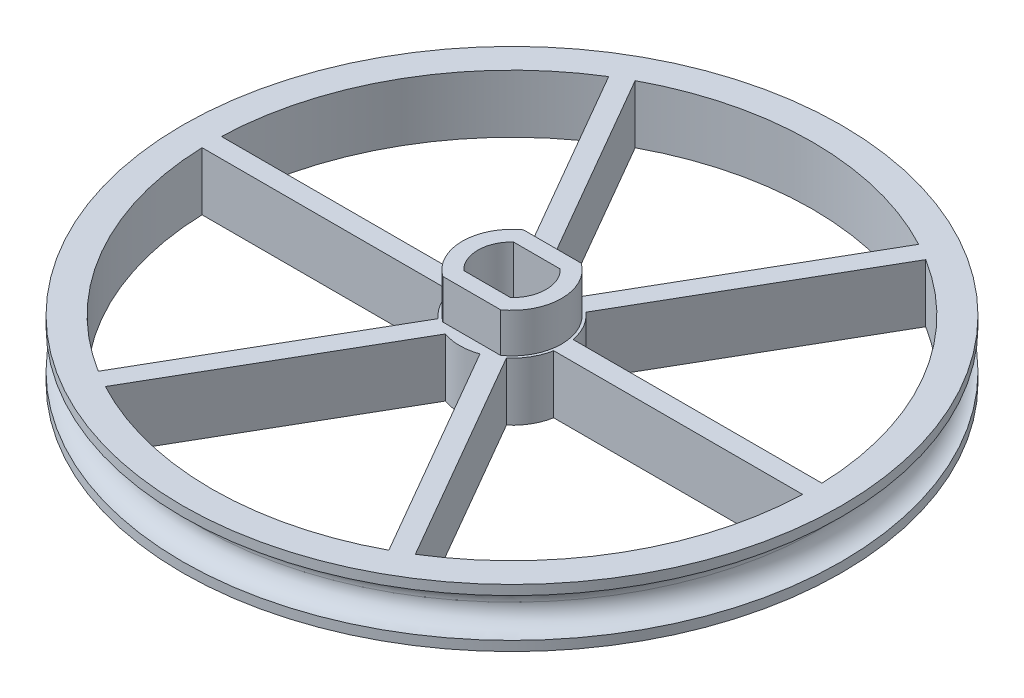
ISO-10303-21;
HEADER;
FILE_DESCRIPTION(('STEP AP214'),'2;1');
FILE_NAME('part.step','',(''),(''),'','','');
FILE_SCHEMA(('AUTOMOTIVE_DESIGN { 1 0 10303 214 1 1 1 1 }'));
ENDSEC;
DATA;
#1=APPLICATION_CONTEXT('core data for automotive mechanical design processes');
#2=APPLICATION_PROTOCOL_DEFINITION('international standard','automotive_design',2000,#1);
#3=PRODUCT_CONTEXT('',#1,'mechanical');
#4=PRODUCT('Part','Part','',(#3));
#5=PRODUCT_RELATED_PRODUCT_CATEGORY('part','',(#4));
#6=PRODUCT_DEFINITION_FORMATION('','',#4);
#7=PRODUCT_DEFINITION_CONTEXT('part definition',#1,'design');
#8=PRODUCT_DEFINITION('design','',#6,#7);
#9=PRODUCT_DEFINITION_SHAPE('','',#8);
#10=(LENGTH_UNIT() NAMED_UNIT(*) SI_UNIT(.MILLI.,.METRE.));
#11=(NAMED_UNIT(*) PLANE_ANGLE_UNIT() SI_UNIT($,.RADIAN.));
#12=(NAMED_UNIT(*) SI_UNIT($,.STERADIAN.) SOLID_ANGLE_UNIT());
#13=UNCERTAINTY_MEASURE_WITH_UNIT(LENGTH_MEASURE(1.E-05),#10,'distance_accuracy_value','');
#14=(GEOMETRIC_REPRESENTATION_CONTEXT(3) GLOBAL_UNCERTAINTY_ASSIGNED_CONTEXT((#13)) GLOBAL_UNIT_ASSIGNED_CONTEXT((#10,
#11,#12)) REPRESENTATION_CONTEXT('',''));
#15=CARTESIAN_POINT('',(0.,0.,0.));
#16=DIRECTION('',(0.,0.,1.));
#17=DIRECTION('',(1.,0.,0.));
#18=AXIS2_PLACEMENT_3D('',#15,#16,#17);
#19=CARTESIAN_POINT('',(0.,-1.96265906091624,0.));
#20=DIRECTION('',(0.,-1.,0.));
#21=DIRECTION('',(0.,0.,-1.));
#22=AXIS2_PLACEMENT_3D('',#19,#20,#21);
#23=CYLINDRICAL_SURFACE('',#22,24.60625);
#24=CARTESIAN_POINT('',(0.,-0.79375,0.));
#25=DIRECTION('',(0.,-1.,0.));
#26=DIRECTION('',(0.,0.,-1.));
#27=AXIS2_PLACEMENT_3D('',#24,#25,#26);
#28=CIRCLE('',#27,24.60625);
#29=CARTESIAN_POINT('',(24.5934442484171,-0.79375,0.793750000000001));
#30=VERTEX_POINT('',#29);
#31=CARTESIAN_POINT('',(12.9841297884627,-0.79375,20.9016724856853));
#32=VERTEX_POINT('',#31);
#33=EDGE_CURVE('E529',#30,#32,#28,.T.);
#34=ORIENTED_EDGE('',*,*,#33,.T.);
#35=DIRECTION('',(0.,-1.,0.));
#36=VECTOR('',#35,1.);
#37=CARTESIAN_POINT('',(12.9841297884627,-1.96265906091624,20.9016724856853));
#38=LINE('',#37,#36);
#39=CARTESIAN_POINT('',(12.9841297884627,3.96875,20.9016724856853));
#40=VERTEX_POINT('',#39);
#41=EDGE_CURVE('E322',#32,#40,#38,.F.);
#42=ORIENTED_EDGE('',*,*,#41,.T.);
#43=CARTESIAN_POINT('',(0.,3.96875,0.));
#44=DIRECTION('',(0.,-1.,0.));
#45=DIRECTION('',(0.,0.,-1.));
#46=AXIS2_PLACEMENT_3D('',#43,#44,#45);
#47=CIRCLE('',#46,24.60625);
#48=CARTESIAN_POINT('',(24.5934442484171,3.96875,0.793750000000001));
#49=VERTEX_POINT('',#48);
#50=EDGE_CURVE('E523',#49,#40,#47,.T.);
#51=ORIENTED_EDGE('',*,*,#50,.F.);
#52=DIRECTION('',(0.,-1.,0.));
#53=VECTOR('',#52,1.);
#54=CARTESIAN_POINT('',(24.5934442484171,-1.96265906091624,0.793750000000001));
#55=LINE('',#54,#53);
#56=EDGE_CURVE('E496',#49,#30,#55,.T.);
#57=ORIENTED_EDGE('',*,*,#56,.T.);
#58=EDGE_LOOP('',(#34,#42,#51,#57));
#59=FACE_BOUND('',#58,.T.);
#60=ADVANCED_FACE('F51',(#59),#23,.F.);
#61=CARTESIAN_POINT('',(0.,-1.96265906091624,0.));
#62=DIRECTION('',(0.,-1.,0.));
#63=DIRECTION('',(0.,0.,-1.));
#64=AXIS2_PLACEMENT_3D('',#61,#62,#63);
#65=CYLINDRICAL_SURFACE('',#64,4.28624999999999);
#66=DIRECTION('',(0.,-1.,0.));
#67=VECTOR('',#66,1.);
#68=CARTESIAN_POINT('',(2.79346440612961,-1.96265906091624,3.25092228055161));
#69=LINE('',#68,#67);
#70=CARTESIAN_POINT('',(2.79346440612961,-0.79375,3.25092228055161));
#71=VERTEX_POINT('',#70);
#72=CARTESIAN_POINT('',(2.79346440612961,3.96875,3.25092228055161));
#73=VERTEX_POINT('',#72);
#74=EDGE_CURVE('E357',#71,#73,#69,.F.);
#75=ORIENTED_EDGE('',*,*,#74,.F.);
#76=CARTESIAN_POINT('',(0.,-0.79375,0.));
#77=DIRECTION('',(0.,-1.,0.));
#78=DIRECTION('',(0.,0.,-1.));
#79=AXIS2_PLACEMENT_3D('',#76,#77,#78);
#80=CIRCLE('',#79,4.28624999999999);
#81=CARTESIAN_POINT('',(4.21211348375135,-0.79375,0.793750000000001));
#82=VERTEX_POINT('',#81);
#83=EDGE_CURVE('E483',#82,#71,#80,.T.);
#84=ORIENTED_EDGE('',*,*,#83,.F.);
#85=DIRECTION('',(0.,-1.,0.));
#86=VECTOR('',#85,1.);
#87=CARTESIAN_POINT('',(4.21211348375135,-1.96265906091624,0.793750000000001));
#88=LINE('',#87,#86);
#89=CARTESIAN_POINT('',(4.21211348375135,3.96875,0.793750000000001));
#90=VERTEX_POINT('',#89);
#91=EDGE_CURVE('E542',#82,#90,#88,.F.);
#92=ORIENTED_EDGE('',*,*,#91,.T.);
#93=CARTESIAN_POINT('',(0.,3.96875,0.));
#94=DIRECTION('',(0.,-1.,0.));
#95=DIRECTION('',(0.,0.,-1.));
#96=AXIS2_PLACEMENT_3D('',#93,#94,#95);
#97=CIRCLE('',#96,4.28624999999999);
#98=EDGE_CURVE('E478',#90,#73,#97,.T.);
#99=ORIENTED_EDGE('',*,*,#98,.T.);
#100=EDGE_LOOP('',(#75,#84,#92,#99));
#101=FACE_BOUND('',#100,.T.);
#102=ADVANCED_FACE('F594',(#101),#65,.T.);
#103=CARTESIAN_POINT('',(11.6093144599549,3.96875,21.6954224856854));
#104=VERTEX_POINT('',#103);
#105=CARTESIAN_POINT('',(-11.6093144599544,3.96875,21.6954224856856));
#106=VERTEX_POINT('',#105);
#107=EDGE_CURVE('E528',#104,#106,#47,.T.);
#108=ORIENTED_EDGE('',*,*,#107,.F.);
#109=DIRECTION('',(0.,-1.,0.));
#110=VECTOR('',#109,1.);
#111=CARTESIAN_POINT('',(11.6093144599549,-1.96265906091624,21.6954224856854));
#112=LINE('',#111,#110);
#113=CARTESIAN_POINT('',(11.6093144599549,-0.79375,21.6954224856854));
#114=VERTEX_POINT('',#113);
#115=EDGE_CURVE('E336',#104,#114,#112,.T.);
#116=ORIENTED_EDGE('',*,*,#115,.T.);
#117=CARTESIAN_POINT('',(-11.6093144599544,-0.79375,21.6954224856856));
#118=VERTEX_POINT('',#117);
#119=EDGE_CURVE('E534',#114,#118,#28,.T.);
#120=ORIENTED_EDGE('',*,*,#119,.T.);
#121=DIRECTION('',(0.,-1.,0.));
#122=VECTOR('',#121,1.);
#123=CARTESIAN_POINT('',(-11.6093144599544,-1.96265906091624,21.6954224856856));
#124=LINE('',#123,#122);
#125=EDGE_CURVE('E361',#118,#106,#124,.F.);
#126=ORIENTED_EDGE('',*,*,#125,.T.);
#127=EDGE_LOOP('',(#108,#116,#120,#126));
#128=FACE_BOUND('',#127,.T.);
#129=ADVANCED_FACE('F597',(#128),#23,.F.);
#130=DIRECTION('',(0.,-1.,0.));
#131=VECTOR('',#130,1.);
#132=CARTESIAN_POINT('',(1.41864907762182,-1.96265906091624,4.04467228055163));
#133=LINE('',#132,#131);
#134=CARTESIAN_POINT('',(1.41864907762182,3.96875,4.04467228055163));
#135=VERTEX_POINT('',#134);
#136=CARTESIAN_POINT('',(1.41864907762182,-0.79375,4.04467228055163));
#137=VERTEX_POINT('',#136);
#138=EDGE_CURVE('E344',#135,#137,#133,.T.);
#139=ORIENTED_EDGE('',*,*,#138,.F.);
#140=CARTESIAN_POINT('',(-1.41864907762174,3.96875,4.04467228055166));
#141=VERTEX_POINT('',#140);
#142=EDGE_CURVE('E482',#135,#141,#97,.T.);
#143=ORIENTED_EDGE('',*,*,#142,.T.);
#144=DIRECTION('',(0.,-1.,0.));
#145=VECTOR('',#144,1.);
#146=CARTESIAN_POINT('',(-1.41864907762174,-1.96265906091624,4.04467228055166));
#147=LINE('',#146,#145);
#148=CARTESIAN_POINT('',(-1.41864907762174,-0.79375,4.04467228055166));
#149=VERTEX_POINT('',#148);
#150=EDGE_CURVE('E388',#149,#141,#147,.F.);
#151=ORIENTED_EDGE('',*,*,#150,.F.);
#152=EDGE_CURVE('E488',#137,#149,#80,.T.);
#153=ORIENTED_EDGE('',*,*,#152,.F.);
#154=EDGE_LOOP('',(#139,#143,#151,#153));
#155=FACE_BOUND('',#154,.T.);
#156=ADVANCED_FACE('F605',(#155),#65,.T.);
#157=CARTESIAN_POINT('',(-12.9841297884623,3.96875,20.9016724856856));
#158=VERTEX_POINT('',#157);
#159=CARTESIAN_POINT('',(-24.5934442484171,3.96875,0.793749999999999));
#160=VERTEX_POINT('',#159);
#161=EDGE_CURVE('E649',#158,#160,#47,.T.);
#162=ORIENTED_EDGE('',*,*,#161,.F.);
#163=DIRECTION('',(0.,-1.,0.));
#164=VECTOR('',#163,1.);
#165=CARTESIAN_POINT('',(-12.9841297884622,-1.96265906091624,20.9016724856856));
#166=LINE('',#165,#164);
#167=CARTESIAN_POINT('',(-12.9841297884622,-0.79375,20.9016724856856));
#168=VERTEX_POINT('',#167);
#169=EDGE_CURVE('E365',#158,#168,#166,.T.);
#170=ORIENTED_EDGE('',*,*,#169,.T.);
#171=CARTESIAN_POINT('',(-24.5934442484171,-0.79375,0.793749999999999));
#172=VERTEX_POINT('',#171);
#173=EDGE_CURVE('E715',#168,#172,#28,.T.);
#174=ORIENTED_EDGE('',*,*,#173,.T.);
#175=DIRECTION('',(0.,-1.,0.));
#176=VECTOR('',#175,1.);
#177=CARTESIAN_POINT('',(-24.5934442484171,-1.96265906091624,0.793749999999999));
#178=LINE('',#177,#176);
#179=EDGE_CURVE('E392',#172,#160,#178,.F.);
#180=ORIENTED_EDGE('',*,*,#179,.T.);
#181=EDGE_LOOP('',(#162,#170,#174,#180));
#182=FACE_BOUND('',#181,.T.);
#183=ADVANCED_FACE('F611',(#182),#23,.F.);
#184=DIRECTION('',(0.,-1.,0.));
#185=VECTOR('',#184,1.);
#186=CARTESIAN_POINT('',(-2.79346440612955,-1.96265906091624,3.25092228055167));
#187=LINE('',#186,#185);
#188=CARTESIAN_POINT('',(-2.79346440612954,3.96875,3.25092228055167));
#189=VERTEX_POINT('',#188);
#190=CARTESIAN_POINT('',(-2.79346440612955,-0.79375,3.25092228055167));
#191=VERTEX_POINT('',#190);
#192=EDGE_CURVE('E374',#189,#191,#187,.T.);
#193=ORIENTED_EDGE('',*,*,#192,.F.);
#194=CARTESIAN_POINT('',(-4.21211348375135,3.96875,0.793749999999999));
#195=VERTEX_POINT('',#194);
#196=EDGE_CURVE('E692',#189,#195,#97,.T.);
#197=ORIENTED_EDGE('',*,*,#196,.T.);
#198=DIRECTION('',(0.,-1.,0.));
#199=VECTOR('',#198,1.);
#200=CARTESIAN_POINT('',(-4.21211348375135,-1.96265906091624,0.793749999999999));
#201=LINE('',#200,#199);
#202=CARTESIAN_POINT('',(-4.21211348375135,-0.79375,0.793749999999999));
#203=VERTEX_POINT('',#202);
#204=EDGE_CURVE('E419',#203,#195,#201,.F.);
#205=ORIENTED_EDGE('',*,*,#204,.F.);
#206=EDGE_CURVE('E718',#191,#203,#80,.T.);
#207=ORIENTED_EDGE('',*,*,#206,.F.);
#208=EDGE_LOOP('',(#193,#197,#205,#207));
#209=FACE_BOUND('',#208,.T.);
#210=ADVANCED_FACE('F633',(#209),#65,.T.);
#211=CARTESIAN_POINT('',(-24.5934442484171,3.96875,-0.793750000000001));
#212=VERTEX_POINT('',#211);
#213=CARTESIAN_POINT('',(-12.9841297884625,3.96875,-20.9016724856854));
#214=VERTEX_POINT('',#213);
#215=EDGE_CURVE('E655',#212,#214,#47,.T.);
#216=ORIENTED_EDGE('',*,*,#215,.F.);
#217=DIRECTION('',(0.,-1.,0.));
#218=VECTOR('',#217,1.);
#219=CARTESIAN_POINT('',(-24.5934442484171,-1.96265906091624,-0.793750000000001));
#220=LINE('',#219,#218);
#221=CARTESIAN_POINT('',(-24.5934442484171,-0.79375,-0.793750000000001));
#222=VERTEX_POINT('',#221);
#223=EDGE_CURVE('E396',#212,#222,#220,.T.);
#224=ORIENTED_EDGE('',*,*,#223,.T.);
#225=CARTESIAN_POINT('',(-12.9841297884625,-0.79375,-20.9016724856854));
#226=VERTEX_POINT('',#225);
#227=EDGE_CURVE('E739',#222,#226,#28,.T.);
#228=ORIENTED_EDGE('',*,*,#227,.T.);
#229=DIRECTION('',(0.,-1.,0.));
#230=VECTOR('',#229,1.);
#231=CARTESIAN_POINT('',(-12.9841297884625,-1.96265906091624,-20.9016724856854));
#232=LINE('',#231,#230);
#233=EDGE_CURVE('E423',#226,#214,#232,.F.);
#234=ORIENTED_EDGE('',*,*,#233,.T.);
#235=EDGE_LOOP('',(#216,#224,#228,#234));
#236=FACE_BOUND('',#235,.T.);
#237=ADVANCED_FACE('F627',(#236),#23,.F.);
#238=DIRECTION('',(0.,-1.,0.));
#239=VECTOR('',#238,1.);
#240=CARTESIAN_POINT('',(-4.21211348375135,-1.96265906091624,-0.793750000000001));
#241=LINE('',#240,#239);
#242=CARTESIAN_POINT('',(-4.21211348375135,3.96875,-0.793750000000001));
#243=VERTEX_POINT('',#242);
#244=CARTESIAN_POINT('',(-4.21211348375135,-0.79375,-0.793750000000001));
#245=VERTEX_POINT('',#244);
#246=EDGE_CURVE('E405',#243,#245,#241,.T.);
#247=ORIENTED_EDGE('',*,*,#246,.F.);
#248=CARTESIAN_POINT('',(-2.79346440612959,3.96875,-3.25092228055163));
#249=VERTEX_POINT('',#248);
#250=EDGE_CURVE('E687',#243,#249,#97,.T.);
#251=ORIENTED_EDGE('',*,*,#250,.T.);
#252=DIRECTION('',(0.,-1.,0.));
#253=VECTOR('',#252,1.);
#254=CARTESIAN_POINT('',(-2.79346440612959,-1.96265906091624,-3.25092228055163));
#255=LINE('',#254,#253);
#256=CARTESIAN_POINT('',(-2.79346440612959,-0.79375,-3.25092228055163));
#257=VERTEX_POINT('',#256);
#258=EDGE_CURVE('E450',#257,#249,#255,.F.);
#259=ORIENTED_EDGE('',*,*,#258,.F.);
#260=EDGE_CURVE('E721',#245,#257,#80,.T.);
#261=ORIENTED_EDGE('',*,*,#260,.F.);
#262=EDGE_LOOP('',(#247,#251,#259,#261));
#263=FACE_BOUND('',#262,.T.);
#264=ADVANCED_FACE('F625',(#263),#65,.T.);
#265=CARTESIAN_POINT('',(-11.6093144599547,3.96875,-21.6954224856854));
#266=VERTEX_POINT('',#265);
#267=CARTESIAN_POINT('',(11.6093144599546,3.96875,-21.6954224856855));
#268=VERTEX_POINT('',#267);
#269=EDGE_CURVE('E658',#266,#268,#47,.T.);
#270=ORIENTED_EDGE('',*,*,#269,.F.);
#271=DIRECTION('',(0.,-1.,0.));
#272=VECTOR('',#271,1.);
#273=CARTESIAN_POINT('',(-11.6093144599548,-1.96265906091624,-21.6954224856854));
#274=LINE('',#273,#272);
#275=CARTESIAN_POINT('',(-11.6093144599548,-0.79375,-21.6954224856854));
#276=VERTEX_POINT('',#275);
#277=EDGE_CURVE('E427',#266,#276,#274,.T.);
#278=ORIENTED_EDGE('',*,*,#277,.T.);
#279=CARTESIAN_POINT('',(11.6093144599546,-0.79375,-21.6954224856855));
#280=VERTEX_POINT('',#279);
#281=EDGE_CURVE('E677',#276,#280,#28,.T.);
#282=ORIENTED_EDGE('',*,*,#281,.T.);
#283=DIRECTION('',(0.,-1.,0.));
#284=VECTOR('',#283,1.);
#285=CARTESIAN_POINT('',(11.6093144599546,-1.96265906091624,-21.6954224856855));
#286=LINE('',#285,#284);
#287=EDGE_CURVE('E454',#280,#268,#286,.F.);
#288=ORIENTED_EDGE('',*,*,#287,.T.);
#289=EDGE_LOOP('',(#270,#278,#282,#288));
#290=FACE_BOUND('',#289,.T.);
#291=ADVANCED_FACE('F614',(#290),#23,.F.);
#292=DIRECTION('',(0.,-1.,0.));
#293=VECTOR('',#292,1.);
#294=CARTESIAN_POINT('',(-1.4186490776218,-1.96265906091624,-4.04467228055164));
#295=LINE('',#294,#293);
#296=CARTESIAN_POINT('',(-1.4186490776218,3.96875,-4.04467228055164));
#297=VERTEX_POINT('',#296);
#298=CARTESIAN_POINT('',(-1.4186490776218,-0.79375,-4.04467228055164));
#299=VERTEX_POINT('',#298);
#300=EDGE_CURVE('E436',#297,#299,#295,.T.);
#301=ORIENTED_EDGE('',*,*,#300,.F.);
#302=CARTESIAN_POINT('',(1.41864907762177,3.96875,-4.04467228055165));
#303=VERTEX_POINT('',#302);
#304=EDGE_CURVE('E684',#297,#303,#97,.T.);
#305=ORIENTED_EDGE('',*,*,#304,.T.);
#306=DIRECTION('',(0.,-1.,0.));
#307=VECTOR('',#306,1.);
#308=CARTESIAN_POINT('',(1.41864907762177,-1.96265906091624,-4.04467228055165));
#309=LINE('',#308,#307);
#310=CARTESIAN_POINT('',(1.41864907762177,-0.79375,-4.04467228055165));
#311=VERTEX_POINT('',#310);
#312=EDGE_CURVE('E549',#311,#303,#309,.F.);
#313=ORIENTED_EDGE('',*,*,#312,.F.);
#314=EDGE_CURVE('E682',#299,#311,#80,.T.);
#315=ORIENTED_EDGE('',*,*,#314,.F.);
#316=EDGE_LOOP('',(#301,#305,#313,#315));
#317=FACE_BOUND('',#316,.T.);
#318=ADVANCED_FACE('F624',(#317),#65,.T.);
#319=CARTESIAN_POINT('',(0.,-1.96265906091624,0.));
#320=DIRECTION('',(0.,-1.,0.));
#321=DIRECTION('',(0.,0.,-1.));
#322=AXIS2_PLACEMENT_3D('',#319,#320,#321);
#323=CYLINDRICAL_SURFACE('',#322,26.9875);
#324=CARTESIAN_POINT('',(0.,-0.79375,0.));
#325=DIRECTION('',(0.,-1.,0.));
#326=DIRECTION('',(0.,0.,-1.));
#327=AXIS2_PLACEMENT_3D('',#324,#325,#326);
#328=CIRCLE('',#327,26.9875);
#329=CARTESIAN_POINT('',(0.,-0.79375,-26.9875));
#330=VERTEX_POINT('',#329);
#331=EDGE_CURVE('E533',#330,#330,#328,.T.);
#332=ORIENTED_EDGE('',*,*,#331,.F.);
#333=EDGE_LOOP('',(#332));
#334=FACE_BOUND('',#333,.T.);
#335=CARTESIAN_POINT('',(0.,0.,0.));
#336=DIRECTION('',(0.,-1.,0.));
#337=DIRECTION('',(0.,0.,-1.));
#338=AXIS2_PLACEMENT_3D('',#335,#336,#337);
#339=CIRCLE('',#338,26.9875);
#340=CARTESIAN_POINT('',(0.,0.,-26.9875));
#341=VERTEX_POINT('',#340);
#342=EDGE_CURVE('E538',#341,#341,#339,.T.);
#343=ORIENTED_EDGE('',*,*,#342,.T.);
#344=EDGE_LOOP('',(#343));
#345=FACE_BOUND('',#344,.T.);
#346=ADVANCED_FACE('F621',(#334,#345),#323,.T.);
#347=CARTESIAN_POINT('',(-26.9875,-0.79375,0.));
#348=DIRECTION('',(0.,1.,0.));
#349=DIRECTION('',(0.,0.,1.));
#350=AXIS2_PLACEMENT_3D('',#347,#348,#349);
#351=PLANE('',#350);
#352=DIRECTION('',(1.,0.,0.));
#353=VECTOR('',#352,1.);
#354=CARTESIAN_POINT('',(1.91765794655877,-0.79375,-2.032));
#355=LINE('',#354,#353);
#356=CARTESIAN_POINT('',(-1.91765794655877,-0.79375,-2.032));
#357=VERTEX_POINT('',#356);
#358=CARTESIAN_POINT('',(1.91765794655877,-0.79375,-2.032));
#359=VERTEX_POINT('',#358);
#360=EDGE_CURVE('E275',#357,#359,#355,.T.);
#361=ORIENTED_EDGE('',*,*,#360,.F.);
#362=CARTESIAN_POINT('',(0.,-0.79375,0.));
#363=DIRECTION('',(0.,-1.,0.));
#364=DIRECTION('',(0.,0.,-1.));
#365=AXIS2_PLACEMENT_3D('',#362,#363,#364);
#366=CIRCLE('',#365,2.794);
#367=CARTESIAN_POINT('',(-1.91765794655877,-0.79375,2.032));
#368=VERTEX_POINT('',#367);
#369=EDGE_CURVE('E68',#368,#357,#366,.T.);
#370=ORIENTED_EDGE('',*,*,#369,.F.);
#371=DIRECTION('',(-1.,0.,0.));
#372=VECTOR('',#371,1.);
#373=CARTESIAN_POINT('',(1.91765794655877,-0.79375,2.032));
#374=LINE('',#373,#372);
#375=CARTESIAN_POINT('',(1.91765794655877,-0.79375,2.032));
#376=VERTEX_POINT('',#375);
#377=EDGE_CURVE('E283',#376,#368,#374,.T.);
#378=ORIENTED_EDGE('',*,*,#377,.F.);
#379=CARTESIAN_POINT('',(0.,-0.79375,0.));
#380=DIRECTION('',(0.,-1.,0.));
#381=DIRECTION('',(0.,0.,-1.));
#382=AXIS2_PLACEMENT_3D('',#379,#380,#381);
#383=CIRCLE('',#382,2.794);
#384=EDGE_CURVE('E265',#359,#376,#383,.T.);
#385=ORIENTED_EDGE('',*,*,#384,.F.);
#386=EDGE_LOOP('',(#361,#370,#378,#385));
#387=FACE_BOUND('',#386,.T.);
#388=DIRECTION('',(0.50000000000001,0.,0.866025403784433));
#389=VECTOR('',#388,1.);
#390=CARTESIAN_POINT('',(1.32871733574614,-0.79375,3.88890593440978));
#391=LINE('',#390,#389);
#392=EDGE_CURVE('E345',#137,#114,#391,.T.);
#393=ORIENTED_EDGE('',*,*,#392,.F.);
#394=ORIENTED_EDGE('',*,*,#152,.T.);
#395=DIRECTION('',(-0.499999999999992,0.,0.866025403784443));
#396=VECTOR('',#395,1.);
#397=CARTESIAN_POINT('',(-1.32871733574606,-0.79375,3.88890593440981));
#398=LINE('',#397,#396);
#399=EDGE_CURVE('E370',#149,#118,#398,.T.);
#400=ORIENTED_EDGE('',*,*,#399,.T.);
#401=ORIENTED_EDGE('',*,*,#119,.F.);
#402=EDGE_LOOP('',(#393,#394,#400,#401));
#403=FACE_BOUND('',#402,.T.);
#404=ORIENTED_EDGE('',*,*,#83,.T.);
#405=DIRECTION('',(0.50000000000001,0.,0.866025403784433));
#406=VECTOR('',#405,1.);
#407=CARTESIAN_POINT('',(2.70353266425393,-0.79375,3.09515593440977));
#408=LINE('',#407,#406);
#409=EDGE_CURVE('E341',#71,#32,#408,.T.);
#410=ORIENTED_EDGE('',*,*,#409,.T.);
#411=ORIENTED_EDGE('',*,*,#33,.F.);
#412=DIRECTION('',(1.,0.,0.));
#413=VECTOR('',#412,1.);
#414=CARTESIAN_POINT('',(4.03225,-0.79375,0.793750000000001));
#415=LINE('',#414,#413);
#416=EDGE_CURVE('E506',#82,#30,#415,.T.);
#417=ORIENTED_EDGE('',*,*,#416,.F.);
#418=EDGE_LOOP('',(#404,#410,#411,#417));
#419=FACE_BOUND('',#418,.T.);
#420=DIRECTION('',(-0.499999999999992,0.,0.866025403784443));
#421=VECTOR('',#420,1.);
#422=CARTESIAN_POINT('',(-2.70353266425387,-0.79375,3.09515593440982));
#423=LINE('',#422,#421);
#424=EDGE_CURVE('E375',#191,#168,#423,.T.);
#425=ORIENTED_EDGE('',*,*,#424,.F.);
#426=ORIENTED_EDGE('',*,*,#206,.T.);
#427=DIRECTION('',(-1.,0.,0.));
#428=VECTOR('',#427,1.);
#429=CARTESIAN_POINT('',(-4.03225,-0.79375,0.793749999999999));
#430=LINE('',#429,#428);
#431=EDGE_CURVE('E401',#203,#172,#430,.T.);
#432=ORIENTED_EDGE('',*,*,#431,.T.);
#433=ORIENTED_EDGE('',*,*,#173,.F.);
#434=EDGE_LOOP('',(#425,#426,#432,#433));
#435=FACE_BOUND('',#434,.T.);
#436=DIRECTION('',(-1.,0.,0.));
#437=VECTOR('',#436,1.);
#438=CARTESIAN_POINT('',(-4.03225,-0.79375,-0.793750000000001));
#439=LINE('',#438,#437);
#440=EDGE_CURVE('E406',#245,#222,#439,.T.);
#441=ORIENTED_EDGE('',*,*,#440,.F.);
#442=ORIENTED_EDGE('',*,*,#260,.T.);
#443=DIRECTION('',(-0.500000000000004,0.,-0.866025403784436));
#444=VECTOR('',#443,1.);
#445=CARTESIAN_POINT('',(-2.70353266425391,-0.79375,-3.09515593440979));
#446=LINE('',#445,#444);
#447=EDGE_CURVE('E432',#257,#226,#446,.T.);
#448=ORIENTED_EDGE('',*,*,#447,.T.);
#449=ORIENTED_EDGE('',*,*,#227,.F.);
#450=EDGE_LOOP('',(#441,#442,#448,#449));
#451=FACE_BOUND('',#450,.T.);
#452=DIRECTION('',(-0.500000000000004,0.,-0.866025403784436));
#453=VECTOR('',#452,1.);
#454=CARTESIAN_POINT('',(-1.32871733574612,-0.79375,-3.88890593440979));
#455=LINE('',#454,#453);
#456=EDGE_CURVE('E437',#299,#276,#455,.T.);
#457=ORIENTED_EDGE('',*,*,#456,.F.);
#458=ORIENTED_EDGE('',*,*,#314,.T.);
#459=DIRECTION('',(0.499999999999998,0.,-0.86602540378444));
#460=VECTOR('',#459,1.);
#461=CARTESIAN_POINT('',(1.32871733574609,-0.79375,-3.8889059344098));
#462=LINE('',#461,#460);
#463=EDGE_CURVE('E463',#311,#280,#462,.T.);
#464=ORIENTED_EDGE('',*,*,#463,.T.);
#465=ORIENTED_EDGE('',*,*,#281,.F.);
#466=EDGE_LOOP('',(#457,#458,#464,#465));
#467=FACE_BOUND('',#466,.T.);
#468=DIRECTION('',(0.499999999999998,0.,-0.86602540378444));
#469=VECTOR('',#468,1.);
#470=CARTESIAN_POINT('',(2.70353266425389,-0.79375,-3.0951559344098));
#471=LINE('',#470,#469);
#472=CARTESIAN_POINT('',(2.79346440612957,-0.79375,-3.25092228055165));
#473=VERTEX_POINT('',#472);
#474=CARTESIAN_POINT('',(12.9841297884624,-0.79375,-20.9016724856855));
#475=VERTEX_POINT('',#474);
#476=EDGE_CURVE('E468',#473,#475,#471,.T.);
#477=ORIENTED_EDGE('',*,*,#476,.F.);
#478=CARTESIAN_POINT('',(4.21211348375135,-0.79375,-0.79375));
#479=VERTEX_POINT('',#478);
#480=EDGE_CURVE('E481',#473,#479,#80,.T.);
#481=ORIENTED_EDGE('',*,*,#480,.T.);
#482=DIRECTION('',(1.,0.,0.));
#483=VECTOR('',#482,1.);
#484=CARTESIAN_POINT('',(4.03225,-0.79375,-0.793749999999999));
#485=LINE('',#484,#483);
#486=CARTESIAN_POINT('',(24.5934442484171,-0.79375,-0.793749999999999));
#487=VERTEX_POINT('',#486);
#488=EDGE_CURVE('E501',#479,#487,#485,.T.);
#489=ORIENTED_EDGE('',*,*,#488,.T.);
#490=EDGE_CURVE('E527',#475,#487,#28,.T.);
#491=ORIENTED_EDGE('',*,*,#490,.F.);
#492=EDGE_LOOP('',(#477,#481,#489,#491));
#493=FACE_BOUND('',#492,.T.);
#494=ORIENTED_EDGE('',*,*,#331,.T.);
#495=EDGE_LOOP('',(#494));
#496=FACE_BOUND('',#495,.T.);
#497=ADVANCED_FACE('F280',(#387,#403,#419,#435,#451,#467,#493,#496),#351,.F.);
#498=CARTESIAN_POINT('',(12.9841297884624,3.96875,-20.9016724856855));
#499=VERTEX_POINT('',#498);
#500=CARTESIAN_POINT('',(24.5934442484171,3.96875,-0.793749999999999));
#501=VERTEX_POINT('',#500);
#502=EDGE_CURVE('E522',#499,#501,#47,.T.);
#503=ORIENTED_EDGE('',*,*,#502,.F.);
#504=DIRECTION('',(0.,-1.,0.));
#505=VECTOR('',#504,1.);
#506=CARTESIAN_POINT('',(12.9841297884624,-1.96265906091624,-20.9016724856855));
#507=LINE('',#506,#505);
#508=EDGE_CURVE('E458',#499,#475,#507,.T.);
#509=ORIENTED_EDGE('',*,*,#508,.T.);
#510=ORIENTED_EDGE('',*,*,#490,.T.);
#511=DIRECTION('',(0.,-1.,0.));
#512=VECTOR('',#511,1.);
#513=CARTESIAN_POINT('',(24.5934442484171,-1.96265906091624,-0.793749999999999));
#514=LINE('',#513,#512);
#515=EDGE_CURVE('E492',#487,#501,#514,.F.);
#516=ORIENTED_EDGE('',*,*,#515,.T.);
#517=EDGE_LOOP('',(#503,#509,#510,#516));
#518=FACE_BOUND('',#517,.T.);
#519=ADVANCED_FACE('F598',(#518),#23,.F.);
#520=CARTESIAN_POINT('',(-26.9875,3.96875,0.));
#521=DIRECTION('',(0.,-1.,0.));
#522=DIRECTION('',(0.,0.,-1.));
#523=AXIS2_PLACEMENT_3D('',#520,#521,#522);
#524=PLANE('',#523);
#525=DIRECTION('',(1.,0.,0.));
#526=VECTOR('',#525,1.);
#527=CARTESIAN_POINT('',(-26.9875,3.96875,-3.302));
#528=LINE('',#527,#526);
#529=CARTESIAN_POINT('',(-2.36915427948456,3.96875,-3.302));
#530=VERTEX_POINT('',#529);
#531=CARTESIAN_POINT('',(2.36915427948456,3.96875,-3.302));
#532=VERTEX_POINT('',#531);
#533=EDGE_CURVE('E61',#530,#532,#528,.T.);
#534=ORIENTED_EDGE('',*,*,#533,.T.);
#535=CARTESIAN_POINT('',(0.,3.96875,0.));
#536=DIRECTION('',(0.,-1.,0.));
#537=DIRECTION('',(0.,0.,-1.));
#538=AXIS2_PLACEMENT_3D('',#535,#536,#537);
#539=CIRCLE('',#538,4.064);
#540=CARTESIAN_POINT('',(2.36915427948456,3.96875,3.302));
#541=VERTEX_POINT('',#540);
#542=EDGE_CURVE('E12',#532,#541,#539,.T.);
#543=ORIENTED_EDGE('',*,*,#542,.T.);
#544=DIRECTION('',(-1.,0.,0.));
#545=VECTOR('',#544,1.);
#546=CARTESIAN_POINT('',(-26.9875,3.96875,3.302));
#547=LINE('',#546,#545);
#548=CARTESIAN_POINT('',(-2.36915427948456,3.96875,3.302));
#549=VERTEX_POINT('',#548);
#550=EDGE_CURVE('E553',#541,#549,#547,.T.);
#551=ORIENTED_EDGE('',*,*,#550,.T.);
#552=CARTESIAN_POINT('',(0.,3.96875,0.));
#553=DIRECTION('',(0.,-1.,0.));
#554=DIRECTION('',(0.,0.,-1.));
#555=AXIS2_PLACEMENT_3D('',#552,#553,#554);
#556=CIRCLE('',#555,4.064);
#557=EDGE_CURVE('E557',#549,#530,#556,.T.);
#558=ORIENTED_EDGE('',*,*,#557,.T.);
#559=EDGE_LOOP('',(#534,#543,#551,#558));
#560=FACE_BOUND('',#559,.T.);
#561=ORIENTED_EDGE('',*,*,#142,.F.);
#562=DIRECTION('',(0.50000000000001,0.,0.866025403784433));
#563=VECTOR('',#562,1.);
#564=CARTESIAN_POINT('',(1.32871733574614,3.96875,3.88890593440978));
#565=LINE('',#564,#563);
#566=EDGE_CURVE('E348',#135,#104,#565,.T.);
#567=ORIENTED_EDGE('',*,*,#566,.T.);
#568=ORIENTED_EDGE('',*,*,#107,.T.);
#569=DIRECTION('',(-0.499999999999992,0.,0.866025403784443));
#570=VECTOR('',#569,1.);
#571=CARTESIAN_POINT('',(-1.32871733574606,3.96875,3.88890593440981));
#572=LINE('',#571,#570);
#573=EDGE_CURVE('E369',#141,#106,#572,.T.);
#574=ORIENTED_EDGE('',*,*,#573,.F.);
#575=EDGE_LOOP('',(#561,#567,#568,#574));
#576=FACE_BOUND('',#575,.T.);
#577=DIRECTION('',(0.50000000000001,0.,0.866025403784433));
#578=VECTOR('',#577,1.);
#579=CARTESIAN_POINT('',(2.70353266425393,3.96875,3.09515593440977));
#580=LINE('',#579,#578);
#581=EDGE_CURVE('E340',#73,#40,#580,.T.);
#582=ORIENTED_EDGE('',*,*,#581,.F.);
#583=ORIENTED_EDGE('',*,*,#98,.F.);
#584=DIRECTION('',(1.,0.,0.));
#585=VECTOR('',#584,1.);
#586=CARTESIAN_POINT('',(4.03225,3.96875,0.793750000000001));
#587=LINE('',#586,#585);
#588=EDGE_CURVE('E509',#90,#49,#587,.T.);
#589=ORIENTED_EDGE('',*,*,#588,.T.);
#590=ORIENTED_EDGE('',*,*,#50,.T.);
#591=EDGE_LOOP('',(#582,#583,#589,#590));
#592=FACE_BOUND('',#591,.T.);
#593=ORIENTED_EDGE('',*,*,#196,.F.);
#594=DIRECTION('',(-0.499999999999992,0.,0.866025403784443));
#595=VECTOR('',#594,1.);
#596=CARTESIAN_POINT('',(-2.70353266425387,3.96875,3.09515593440982));
#597=LINE('',#596,#595);
#598=EDGE_CURVE('E378',#189,#158,#597,.T.);
#599=ORIENTED_EDGE('',*,*,#598,.T.);
#600=ORIENTED_EDGE('',*,*,#161,.T.);
#601=DIRECTION('',(-1.,0.,0.));
#602=VECTOR('',#601,1.);
#603=CARTESIAN_POINT('',(-4.03225,3.96875,0.793749999999999));
#604=LINE('',#603,#602);
#605=EDGE_CURVE('E400',#195,#160,#604,.T.);
#606=ORIENTED_EDGE('',*,*,#605,.F.);
#607=EDGE_LOOP('',(#593,#599,#600,#606));
#608=FACE_BOUND('',#607,.T.);
#609=ORIENTED_EDGE('',*,*,#250,.F.);
#610=DIRECTION('',(-1.,0.,0.));
#611=VECTOR('',#610,1.);
#612=CARTESIAN_POINT('',(-4.03225,3.96875,-0.793750000000001));
#613=LINE('',#612,#611);
#614=EDGE_CURVE('E409',#243,#212,#613,.T.);
#615=ORIENTED_EDGE('',*,*,#614,.T.);
#616=ORIENTED_EDGE('',*,*,#215,.T.);
#617=DIRECTION('',(-0.500000000000004,0.,-0.866025403784436));
#618=VECTOR('',#617,1.);
#619=CARTESIAN_POINT('',(-2.70353266425391,3.96875,-3.09515593440979));
#620=LINE('',#619,#618);
#621=EDGE_CURVE('E431',#249,#214,#620,.T.);
#622=ORIENTED_EDGE('',*,*,#621,.F.);
#623=EDGE_LOOP('',(#609,#615,#616,#622));
#624=FACE_BOUND('',#623,.T.);
#625=ORIENTED_EDGE('',*,*,#304,.F.);
#626=DIRECTION('',(-0.500000000000004,0.,-0.866025403784436));
#627=VECTOR('',#626,1.);
#628=CARTESIAN_POINT('',(-1.32871733574612,3.96875,-3.88890593440979));
#629=LINE('',#628,#627);
#630=EDGE_CURVE('E440',#297,#266,#629,.T.);
#631=ORIENTED_EDGE('',*,*,#630,.T.);
#632=ORIENTED_EDGE('',*,*,#269,.T.);
#633=DIRECTION('',(0.499999999999998,0.,-0.86602540378444));
#634=VECTOR('',#633,1.);
#635=CARTESIAN_POINT('',(1.32871733574609,3.96875,-3.8889059344098));
#636=LINE('',#635,#634);
#637=EDGE_CURVE('E462',#303,#268,#636,.T.);
#638=ORIENTED_EDGE('',*,*,#637,.F.);
#639=EDGE_LOOP('',(#625,#631,#632,#638));
#640=FACE_BOUND('',#639,.T.);
#641=CARTESIAN_POINT('',(0.,3.96875,0.));
#642=DIRECTION('',(0.,-1.,0.));
#643=DIRECTION('',(0.,0.,-1.));
#644=AXIS2_PLACEMENT_3D('',#641,#642,#643);
#645=CIRCLE('',#644,26.9875);
#646=CARTESIAN_POINT('',(0.,3.96875,-26.9875));
#647=VERTEX_POINT('',#646);
#648=EDGE_CURVE('E518',#647,#647,#645,.T.);
#649=ORIENTED_EDGE('',*,*,#648,.F.);
#650=EDGE_LOOP('',(#649));
#651=FACE_BOUND('',#650,.T.);
#652=CARTESIAN_POINT('',(2.79346440612957,3.96875,-3.25092228055165));
#653=VERTEX_POINT('',#652);
#654=CARTESIAN_POINT('',(4.21211348375135,3.96875,-0.79375));
#655=VERTEX_POINT('',#654);
#656=EDGE_CURVE('E467',#653,#655,#97,.T.);
#657=ORIENTED_EDGE('',*,*,#656,.F.);
#658=DIRECTION('',(0.499999999999998,0.,-0.86602540378444));
#659=VECTOR('',#658,1.);
#660=CARTESIAN_POINT('',(2.70353266425389,3.96875,-3.0951559344098));
#661=LINE('',#660,#659);
#662=EDGE_CURVE('E471',#653,#499,#661,.T.);
#663=ORIENTED_EDGE('',*,*,#662,.T.);
#664=ORIENTED_EDGE('',*,*,#502,.T.);
#665=DIRECTION('',(1.,0.,0.));
#666=VECTOR('',#665,1.);
#667=CARTESIAN_POINT('',(4.03225,3.96875,-0.793749999999999));
#668=LINE('',#667,#666);
#669=EDGE_CURVE('E500',#655,#501,#668,.T.);
#670=ORIENTED_EDGE('',*,*,#669,.F.);
#671=EDGE_LOOP('',(#657,#663,#664,#670));
#672=FACE_BOUND('',#671,.T.);
#673=ADVANCED_FACE('F564',(#560,#576,#592,#608,#624,#640,#651,#672),#524,.F.);
#674=CARTESIAN_POINT('',(0.,-1.96265906091624,0.));
#675=DIRECTION('',(0.,-1.,0.));
#676=DIRECTION('',(0.,0.,-1.));
#677=AXIS2_PLACEMENT_3D('',#674,#675,#676);
#678=CYLINDRICAL_SURFACE('',#677,26.9875);
#679=CARTESIAN_POINT('',(0.,3.175,0.));
#680=DIRECTION('',(0.,-1.,0.));
#681=DIRECTION('',(0.,0.,-1.));
#682=AXIS2_PLACEMENT_3D('',#679,#680,#681);
#683=CIRCLE('',#682,26.9875);
#684=CARTESIAN_POINT('',(0.,3.175,-26.9875));
#685=VERTEX_POINT('',#684);
#686=EDGE_CURVE('E505',#685,#685,#683,.T.);
#687=ORIENTED_EDGE('',*,*,#686,.F.);
#688=EDGE_LOOP('',(#687));
#689=FACE_BOUND('',#688,.T.);
#690=ORIENTED_EDGE('',*,*,#648,.T.);
#691=EDGE_LOOP('',(#690));
#692=FACE_BOUND('',#691,.T.);
#693=ADVANCED_FACE('F620',(#689,#692),#678,.T.);
#694=CARTESIAN_POINT('',(4.03225,-0.79375,-0.793749999999999));
#695=DIRECTION('',(0.,0.,-1.));
#696=DIRECTION('',(-1.,0.,0.));
#697=AXIS2_PLACEMENT_3D('',#694,#695,#696);
#698=PLANE('',#697);
#699=DIRECTION('',(0.,-1.,0.));
#700=VECTOR('',#699,1.);
#701=CARTESIAN_POINT('',(4.21211348375135,-1.96265906091624,-0.793749999999999));
#702=LINE('',#701,#700);
#703=EDGE_CURVE('E487',#655,#479,#702,.T.);
#704=ORIENTED_EDGE('',*,*,#703,.F.);
#705=ORIENTED_EDGE('',*,*,#669,.T.);
#706=ORIENTED_EDGE('',*,*,#515,.F.);
#707=ORIENTED_EDGE('',*,*,#488,.F.);
#708=EDGE_LOOP('',(#704,#705,#706,#707));
#709=FACE_BOUND('',#708,.T.);
#710=ADVANCED_FACE('F671',(#709),#698,.T.);
#711=CARTESIAN_POINT('',(4.03225,-0.79375,0.793750000000001));
#712=DIRECTION('',(0.,0.,1.));
#713=DIRECTION('',(1.,0.,0.));
#714=AXIS2_PLACEMENT_3D('',#711,#712,#713);
#715=PLANE('',#714);
#716=ORIENTED_EDGE('',*,*,#91,.F.);
#717=ORIENTED_EDGE('',*,*,#416,.T.);
#718=ORIENTED_EDGE('',*,*,#56,.F.);
#719=ORIENTED_EDGE('',*,*,#588,.F.);
#720=EDGE_LOOP('',(#716,#717,#718,#719));
#721=FACE_BOUND('',#720,.T.);
#722=ADVANCED_FACE('F782',(#721),#715,.T.);
#723=DIRECTION('',(0.,-1.,0.));
#724=VECTOR('',#723,1.);
#725=CARTESIAN_POINT('',(2.79346440612957,-1.96265906091624,-3.25092228055165));
#726=LINE('',#725,#724);
#727=EDGE_CURVE('E545',#653,#473,#726,.T.);
#728=ORIENTED_EDGE('',*,*,#727,.F.);
#729=ORIENTED_EDGE('',*,*,#656,.T.);
#730=ORIENTED_EDGE('',*,*,#703,.T.);
#731=ORIENTED_EDGE('',*,*,#480,.F.);
#732=EDGE_LOOP('',(#728,#729,#730,#731));
#733=FACE_BOUND('',#732,.T.);
#734=ADVANCED_FACE('F606',(#733),#65,.T.);
#735=CARTESIAN_POINT('',(1.32871733574609,-0.79375,-3.8889059344098));
#736=DIRECTION('',(-0.86602540378444,0.,-0.499999999999998));
#737=DIRECTION('',(-0.499999999999998,0.,0.86602540378444));
#738=AXIS2_PLACEMENT_3D('',#735,#736,#737);
#739=PLANE('',#738);
#740=ORIENTED_EDGE('',*,*,#463,.F.);
#741=ORIENTED_EDGE('',*,*,#312,.T.);
#742=ORIENTED_EDGE('',*,*,#637,.T.);
#743=ORIENTED_EDGE('',*,*,#287,.F.);
#744=EDGE_LOOP('',(#740,#741,#742,#743));
#745=FACE_BOUND('',#744,.T.);
#746=ADVANCED_FACE('F737',(#745),#739,.T.);
#747=CARTESIAN_POINT('',(2.70353266425389,-0.79375,-3.0951559344098));
#748=DIRECTION('',(0.86602540378444,0.,0.499999999999998));
#749=DIRECTION('',(0.499999999999998,0.,-0.86602540378444));
#750=AXIS2_PLACEMENT_3D('',#747,#748,#749);
#751=PLANE('',#750);
#752=ORIENTED_EDGE('',*,*,#662,.F.);
#753=ORIENTED_EDGE('',*,*,#727,.T.);
#754=ORIENTED_EDGE('',*,*,#476,.T.);
#755=ORIENTED_EDGE('',*,*,#508,.F.);
#756=EDGE_LOOP('',(#752,#753,#754,#755));
#757=FACE_BOUND('',#756,.T.);
#758=ADVANCED_FACE('F775',(#757),#751,.T.);
#759=CARTESIAN_POINT('',(-2.70353266425391,-0.79375,-3.09515593440979));
#760=DIRECTION('',(-0.866025403784436,0.,0.500000000000004));
#761=DIRECTION('',(0.500000000000004,0.,0.866025403784436));
#762=AXIS2_PLACEMENT_3D('',#759,#760,#761);
#763=PLANE('',#762);
#764=ORIENTED_EDGE('',*,*,#447,.F.);
#765=ORIENTED_EDGE('',*,*,#258,.T.);
#766=ORIENTED_EDGE('',*,*,#621,.T.);
#767=ORIENTED_EDGE('',*,*,#233,.F.);
#768=EDGE_LOOP('',(#764,#765,#766,#767));
#769=FACE_BOUND('',#768,.T.);
#770=ADVANCED_FACE('F771',(#769),#763,.T.);
#771=CARTESIAN_POINT('',(-1.32871733574612,-0.79375,-3.88890593440979));
#772=DIRECTION('',(0.866025403784436,0.,-0.500000000000004));
#773=DIRECTION('',(-0.500000000000004,0.,-0.866025403784436));
#774=AXIS2_PLACEMENT_3D('',#771,#772,#773);
#775=PLANE('',#774);
#776=ORIENTED_EDGE('',*,*,#630,.F.);
#777=ORIENTED_EDGE('',*,*,#300,.T.);
#778=ORIENTED_EDGE('',*,*,#456,.T.);
#779=ORIENTED_EDGE('',*,*,#277,.F.);
#780=EDGE_LOOP('',(#776,#777,#778,#779));
#781=FACE_BOUND('',#780,.T.);
#782=ADVANCED_FACE('F768',(#781),#775,.T.);
#783=CARTESIAN_POINT('',(-4.03225,-0.79375,0.793749999999999));
#784=DIRECTION('',(0.,0.,1.));
#785=DIRECTION('',(1.,0.,0.));
#786=AXIS2_PLACEMENT_3D('',#783,#784,#785);
#787=PLANE('',#786);
#788=ORIENTED_EDGE('',*,*,#431,.F.);
#789=ORIENTED_EDGE('',*,*,#204,.T.);
#790=ORIENTED_EDGE('',*,*,#605,.T.);
#791=ORIENTED_EDGE('',*,*,#179,.F.);
#792=EDGE_LOOP('',(#788,#789,#790,#791));
#793=FACE_BOUND('',#792,.T.);
#794=ADVANCED_FACE('F745',(#793),#787,.T.);
#795=CARTESIAN_POINT('',(-4.03225,-0.79375,-0.793750000000001));
#796=DIRECTION('',(0.,0.,-1.));
#797=DIRECTION('',(-1.,0.,0.));
#798=AXIS2_PLACEMENT_3D('',#795,#796,#797);
#799=PLANE('',#798);
#800=ORIENTED_EDGE('',*,*,#614,.F.);
#801=ORIENTED_EDGE('',*,*,#246,.T.);
#802=ORIENTED_EDGE('',*,*,#440,.T.);
#803=ORIENTED_EDGE('',*,*,#223,.F.);
#804=EDGE_LOOP('',(#800,#801,#802,#803));
#805=FACE_BOUND('',#804,.T.);
#806=ADVANCED_FACE('F759',(#805),#799,.T.);
#807=CARTESIAN_POINT('',(-1.32871733574606,-0.79375,3.88890593440981));
#808=DIRECTION('',(0.866025403784443,0.,0.499999999999992));
#809=DIRECTION('',(0.499999999999992,0.,-0.866025403784443));
#810=AXIS2_PLACEMENT_3D('',#807,#808,#809);
#811=PLANE('',#810);
#812=ORIENTED_EDGE('',*,*,#399,.F.);
#813=ORIENTED_EDGE('',*,*,#150,.T.);
#814=ORIENTED_EDGE('',*,*,#573,.T.);
#815=ORIENTED_EDGE('',*,*,#125,.F.);
#816=EDGE_LOOP('',(#812,#813,#814,#815));
#817=FACE_BOUND('',#816,.T.);
#818=ADVANCED_FACE('F708',(#817),#811,.T.);
#819=CARTESIAN_POINT('',(-2.70353266425387,-0.79375,3.09515593440982));
#820=DIRECTION('',(-0.866025403784443,0.,-0.499999999999992));
#821=DIRECTION('',(-0.499999999999992,0.,0.866025403784443));
#822=AXIS2_PLACEMENT_3D('',#819,#820,#821);
#823=PLANE('',#822);
#824=ORIENTED_EDGE('',*,*,#598,.F.);
#825=ORIENTED_EDGE('',*,*,#192,.T.);
#826=ORIENTED_EDGE('',*,*,#424,.T.);
#827=ORIENTED_EDGE('',*,*,#169,.F.);
#828=EDGE_LOOP('',(#824,#825,#826,#827));
#829=FACE_BOUND('',#828,.T.);
#830=ADVANCED_FACE('F748',(#829),#823,.T.);
#831=CARTESIAN_POINT('',(2.70353266425393,-0.79375,3.09515593440977));
#832=DIRECTION('',(0.866025403784433,0.,-0.50000000000001));
#833=DIRECTION('',(-0.50000000000001,0.,-0.866025403784433));
#834=AXIS2_PLACEMENT_3D('',#831,#832,#833);
#835=PLANE('',#834);
#836=ORIENTED_EDGE('',*,*,#409,.F.);
#837=ORIENTED_EDGE('',*,*,#74,.T.);
#838=ORIENTED_EDGE('',*,*,#581,.T.);
#839=ORIENTED_EDGE('',*,*,#41,.F.);
#840=EDGE_LOOP('',(#836,#837,#838,#839));
#841=FACE_BOUND('',#840,.T.);
#842=ADVANCED_FACE('F750',(#841),#835,.T.);
#843=CARTESIAN_POINT('',(1.32871733574614,-0.79375,3.88890593440978));
#844=DIRECTION('',(-0.866025403784433,0.,0.50000000000001));
#845=DIRECTION('',(0.50000000000001,0.,0.866025403784433));
#846=AXIS2_PLACEMENT_3D('',#843,#844,#845);
#847=PLANE('',#846);
#848=ORIENTED_EDGE('',*,*,#566,.F.);
#849=ORIENTED_EDGE('',*,*,#138,.T.);
#850=ORIENTED_EDGE('',*,*,#392,.T.);
#851=ORIENTED_EDGE('',*,*,#115,.F.);
#852=EDGE_LOOP('',(#848,#849,#850,#851));
#853=FACE_BOUND('',#852,.T.);
#854=ADVANCED_FACE('F756',(#853),#847,.T.);
#855=CARTESIAN_POINT('',(0.,7.20625,0.));
#856=DIRECTION('',(0.,-1.,0.));
#857=DIRECTION('',(0.,0.,-1.));
#858=AXIS2_PLACEMENT_3D('',#855,#856,#857);
#859=CYLINDRICAL_SURFACE('',#858,4.064);
#860=ORIENTED_EDGE('',*,*,#542,.F.);
#861=DIRECTION('',(0.,-1.,0.));
#862=VECTOR('',#861,1.);
#863=CARTESIAN_POINT('',(2.36915427948456,7.20625,-3.302));
#864=LINE('',#863,#862);
#865=CARTESIAN_POINT('',(2.36915427948456,7.20625,-3.302));
#866=VERTEX_POINT('',#865);
#867=EDGE_CURVE('E318',#866,#532,#864,.T.);
#868=ORIENTED_EDGE('',*,*,#867,.F.);
#869=CARTESIAN_POINT('',(0.,7.20625,0.));
#870=DIRECTION('',(0.,-1.,0.));
#871=DIRECTION('',(0.,0.,-1.));
#872=AXIS2_PLACEMENT_3D('',#869,#870,#871);
#873=CIRCLE('',#872,4.064);
#874=CARTESIAN_POINT('',(2.36915427948456,7.20625,3.302));
#875=VERTEX_POINT('',#874);
#876=EDGE_CURVE('E300',#866,#875,#873,.T.);
#877=ORIENTED_EDGE('',*,*,#876,.T.);
#878=DIRECTION('',(0.,-1.,0.));
#879=VECTOR('',#878,1.);
#880=CARTESIAN_POINT('',(2.36915427948456,7.20625,3.302));
#881=LINE('',#880,#879);
#882=EDGE_CURVE('E317',#875,#541,#881,.T.);
#883=ORIENTED_EDGE('',*,*,#882,.T.);
#884=EDGE_LOOP('',(#860,#868,#877,#883));
#885=FACE_BOUND('',#884,.T.);
#886=ADVANCED_FACE('F578',(#885),#859,.T.);
#887=CARTESIAN_POINT('',(-2.36915427948456,7.20625,-3.302));
#888=DIRECTION('',(0.,0.,-1.));
#889=DIRECTION('',(-1.,0.,0.));
#890=AXIS2_PLACEMENT_3D('',#887,#888,#889);
#891=PLANE('',#890);
#892=ORIENTED_EDGE('',*,*,#533,.F.);
#893=DIRECTION('',(0.,-1.,0.));
#894=VECTOR('',#893,1.);
#895=CARTESIAN_POINT('',(-2.36915427948456,7.20625,-3.302));
#896=LINE('',#895,#894);
#897=CARTESIAN_POINT('',(-2.36915427948456,7.20625,-3.302));
#898=VERTEX_POINT('',#897);
#899=EDGE_CURVE('E323',#898,#530,#896,.T.);
#900=ORIENTED_EDGE('',*,*,#899,.F.);
#901=DIRECTION('',(1.,0.,0.));
#902=VECTOR('',#901,1.);
#903=CARTESIAN_POINT('',(-2.36915427948456,7.20625,-3.302));
#904=LINE('',#903,#902);
#905=EDGE_CURVE('E313',#898,#866,#904,.T.);
#906=ORIENTED_EDGE('',*,*,#905,.T.);
#907=ORIENTED_EDGE('',*,*,#867,.T.);
#908=EDGE_LOOP('',(#892,#900,#906,#907));
#909=FACE_BOUND('',#908,.T.);
#910=ADVANCED_FACE('F568',(#909),#891,.T.);
#911=CARTESIAN_POINT('',(0.,7.20625,0.));
#912=DIRECTION('',(0.,-1.,0.));
#913=DIRECTION('',(0.,0.,-1.));
#914=AXIS2_PLACEMENT_3D('',#911,#912,#913);
#915=CYLINDRICAL_SURFACE('',#914,4.064);
#916=ORIENTED_EDGE('',*,*,#557,.F.);
#917=DIRECTION('',(0.,-1.,0.));
#918=VECTOR('',#917,1.);
#919=CARTESIAN_POINT('',(-2.36915427948456,7.20625,3.302));
#920=LINE('',#919,#918);
#921=CARTESIAN_POINT('',(-2.36915427948456,7.20625,3.302));
#922=VERTEX_POINT('',#921);
#923=EDGE_CURVE('E327',#922,#549,#920,.T.);
#924=ORIENTED_EDGE('',*,*,#923,.F.);
#925=CARTESIAN_POINT('',(0.,7.20625,0.));
#926=DIRECTION('',(0.,-1.,0.));
#927=DIRECTION('',(0.,0.,-1.));
#928=AXIS2_PLACEMENT_3D('',#925,#926,#927);
#929=CIRCLE('',#928,4.064);
#930=EDGE_CURVE('E309',#922,#898,#929,.T.);
#931=ORIENTED_EDGE('',*,*,#930,.T.);
#932=ORIENTED_EDGE('',*,*,#899,.T.);
#933=EDGE_LOOP('',(#916,#924,#931,#932));
#934=FACE_BOUND('',#933,.T.);
#935=ADVANCED_FACE('F570',(#934),#915,.T.);
#936=CARTESIAN_POINT('',(2.36915427948456,7.20625,3.302));
#937=DIRECTION('',(0.,0.,1.));
#938=DIRECTION('',(1.,0.,0.));
#939=AXIS2_PLACEMENT_3D('',#936,#937,#938);
#940=PLANE('',#939);
#941=ORIENTED_EDGE('',*,*,#550,.F.);
#942=ORIENTED_EDGE('',*,*,#882,.F.);
#943=DIRECTION('',(-1.,0.,0.));
#944=VECTOR('',#943,1.);
#945=CARTESIAN_POINT('',(2.36915427948456,7.20625,3.302));
#946=LINE('',#945,#944);
#947=EDGE_CURVE('E305',#875,#922,#946,.T.);
#948=ORIENTED_EDGE('',*,*,#947,.T.);
#949=ORIENTED_EDGE('',*,*,#923,.T.);
#950=EDGE_LOOP('',(#941,#942,#948,#949));
#951=FACE_BOUND('',#950,.T.);
#952=ADVANCED_FACE('F580',(#951),#940,.T.);
#953=CARTESIAN_POINT('',(0.,7.20625,0.));
#954=DIRECTION('',(0.,-1.,0.));
#955=DIRECTION('',(0.,0.,-1.));
#956=AXIS2_PLACEMENT_3D('',#953,#954,#955);
#957=PLANE('',#956);
#958=DIRECTION('',(1.,0.,0.));
#959=VECTOR('',#958,1.);
#960=CARTESIAN_POINT('',(1.91765794655877,7.20625,2.032));
#961=LINE('',#960,#959);
#962=CARTESIAN_POINT('',(-1.91765794655877,7.20625,2.032));
#963=VERTEX_POINT('',#962);
#964=CARTESIAN_POINT('',(1.91765794655877,7.20625,2.032));
#965=VERTEX_POINT('',#964);
#966=EDGE_CURVE('E808',#963,#965,#961,.T.);
#967=ORIENTED_EDGE('',*,*,#966,.F.);
#968=CARTESIAN_POINT('',(0.,7.20625,0.));
#969=DIRECTION('',(0.,-1.,0.));
#970=DIRECTION('',(0.,0.,-1.));
#971=AXIS2_PLACEMENT_3D('',#968,#969,#970);
#972=CIRCLE('',#971,2.794);
#973=CARTESIAN_POINT('',(-1.91765794655877,7.20625,-2.032));
#974=VERTEX_POINT('',#973);
#975=EDGE_CURVE('E301',#974,#963,#972,.F.);
#976=ORIENTED_EDGE('',*,*,#975,.F.);
#977=DIRECTION('',(-1.,0.,0.));
#978=VECTOR('',#977,1.);
#979=CARTESIAN_POINT('',(1.91765794655877,7.20625,-2.032));
#980=LINE('',#979,#978);
#981=CARTESIAN_POINT('',(1.91765794655877,7.20625,-2.032));
#982=VERTEX_POINT('',#981);
#983=EDGE_CURVE('E297',#982,#974,#980,.T.);
#984=ORIENTED_EDGE('',*,*,#983,.F.);
#985=CARTESIAN_POINT('',(0.,7.20625,0.));
#986=DIRECTION('',(0.,-1.,0.));
#987=DIRECTION('',(0.,0.,-1.));
#988=AXIS2_PLACEMENT_3D('',#985,#986,#987);
#989=CIRCLE('',#988,2.794);
#990=EDGE_CURVE('E268',#965,#982,#989,.F.);
#991=ORIENTED_EDGE('',*,*,#990,.F.);
#992=EDGE_LOOP('',(#967,#976,#984,#991));
#993=FACE_BOUND('',#992,.T.);
#994=ORIENTED_EDGE('',*,*,#876,.F.);
#995=ORIENTED_EDGE('',*,*,#905,.F.);
#996=ORIENTED_EDGE('',*,*,#930,.F.);
#997=ORIENTED_EDGE('',*,*,#947,.F.);
#998=EDGE_LOOP('',(#994,#995,#996,#997));
#999=FACE_BOUND('',#998,.T.);
#1000=ADVANCED_FACE('F576',(#993,#999),#957,.F.);
#1001=CARTESIAN_POINT('',(0.,14.1157970184376,0.));
#1002=DIRECTION('',(0.,-1.,0.));
#1003=DIRECTION('',(0.,0.,-1.));
#1004=AXIS2_PLACEMENT_3D('',#1001,#1002,#1003);
#1005=CYLINDRICAL_SURFACE('',#1004,2.794);
#1006=ORIENTED_EDGE('',*,*,#975,.T.);
#1007=DIRECTION('',(0.,-1.,0.));
#1008=VECTOR('',#1007,1.);
#1009=CARTESIAN_POINT('',(-1.91765794655877,14.1157970184376,2.032));
#1010=LINE('',#1009,#1008);
#1011=EDGE_CURVE('E290',#963,#368,#1010,.T.);
#1012=ORIENTED_EDGE('',*,*,#1011,.T.);
#1013=ORIENTED_EDGE('',*,*,#369,.T.);
#1014=DIRECTION('',(0.,-1.,0.));
#1015=VECTOR('',#1014,1.);
#1016=CARTESIAN_POINT('',(-1.91765794655877,14.1157970184376,-2.032));
#1017=LINE('',#1016,#1015);
#1018=EDGE_CURVE('E272',#974,#357,#1017,.T.);
#1019=ORIENTED_EDGE('',*,*,#1018,.F.);
#1020=EDGE_LOOP('',(#1006,#1012,#1013,#1019));
#1021=FACE_BOUND('',#1020,.T.);
#1022=ADVANCED_FACE('F588',(#1021),#1005,.F.);
#1023=CARTESIAN_POINT('',(1.91765794655877,14.1157970184376,2.032));
#1024=DIRECTION('',(0.,0.,1.));
#1025=DIRECTION('',(1.,0.,0.));
#1026=AXIS2_PLACEMENT_3D('',#1023,#1024,#1025);
#1027=PLANE('',#1026);
#1028=ORIENTED_EDGE('',*,*,#966,.T.);
#1029=DIRECTION('',(0.,-1.,0.));
#1030=VECTOR('',#1029,1.);
#1031=CARTESIAN_POINT('',(1.91765794655877,14.1157970184376,2.032));
#1032=LINE('',#1031,#1030);
#1033=EDGE_CURVE('E271',#965,#376,#1032,.T.);
#1034=ORIENTED_EDGE('',*,*,#1033,.T.);
#1035=ORIENTED_EDGE('',*,*,#377,.T.);
#1036=ORIENTED_EDGE('',*,*,#1011,.F.);
#1037=EDGE_LOOP('',(#1028,#1034,#1035,#1036));
#1038=FACE_BOUND('',#1037,.T.);
#1039=ADVANCED_FACE('F815',(#1038),#1027,.F.);
#1040=CARTESIAN_POINT('',(0.,14.1157970184376,0.));
#1041=DIRECTION('',(0.,-1.,0.));
#1042=DIRECTION('',(0.,0.,-1.));
#1043=AXIS2_PLACEMENT_3D('',#1040,#1041,#1042);
#1044=CYLINDRICAL_SURFACE('',#1043,2.794);
#1045=ORIENTED_EDGE('',*,*,#990,.T.);
#1046=DIRECTION('',(0.,-1.,0.));
#1047=VECTOR('',#1046,1.);
#1048=CARTESIAN_POINT('',(1.91765794655877,14.1157970184376,-2.032));
#1049=LINE('',#1048,#1047);
#1050=EDGE_CURVE('E76',#982,#359,#1049,.T.);
#1051=ORIENTED_EDGE('',*,*,#1050,.T.);
#1052=ORIENTED_EDGE('',*,*,#384,.T.);
#1053=ORIENTED_EDGE('',*,*,#1033,.F.);
#1054=EDGE_LOOP('',(#1045,#1051,#1052,#1053));
#1055=FACE_BOUND('',#1054,.T.);
#1056=ADVANCED_FACE('F262',(#1055),#1044,.F.);
#1057=CARTESIAN_POINT('',(1.91765794655877,14.1157970184376,-2.032));
#1058=DIRECTION('',(0.,0.,-1.));
#1059=DIRECTION('',(-1.,0.,0.));
#1060=AXIS2_PLACEMENT_3D('',#1057,#1058,#1059);
#1061=PLANE('',#1060);
#1062=ORIENTED_EDGE('',*,*,#983,.T.);
#1063=ORIENTED_EDGE('',*,*,#1018,.T.);
#1064=ORIENTED_EDGE('',*,*,#360,.T.);
#1065=ORIENTED_EDGE('',*,*,#1050,.F.);
#1066=EDGE_LOOP('',(#1062,#1063,#1064,#1065));
#1067=FACE_BOUND('',#1066,.T.);
#1068=ADVANCED_FACE('F276',(#1067),#1061,.F.);
#1069=CARTESIAN_POINT('',(0.,1.5875,0.));
#1070=DIRECTION('',(0.,1.,0.));
#1071=DIRECTION('',(0.,0.,1.));
#1072=AXIS2_PLACEMENT_3D('',#1069,#1070,#1071);
#1073=TOROIDAL_SURFACE('',#1072,26.9875,1.5875);
#1074=ORIENTED_EDGE('',*,*,#686,.T.);
#1075=EDGE_LOOP('',(#1074));
#1076=FACE_BOUND('',#1075,.T.);
#1077=CARTESIAN_POINT('',(0.,1.5875,0.));
#1078=DIRECTION('',(0.,1.,0.));
#1079=DIRECTION('',(0.,0.,1.));
#1080=AXIS2_PLACEMENT_3D('',#1077,#1078,#1079);
#1081=CIRCLE('',#1080,25.4);
#1082=CARTESIAN_POINT('',(0.,1.5875,25.4));
#1083=VERTEX_POINT('',#1082);
#1084=EDGE_CURVE('E55',#1083,#1083,#1081,.F.);
#1085=ORIENTED_EDGE('',*,*,#1084,.F.);
#1086=EDGE_LOOP('',(#1085));
#1087=FACE_BOUND('',#1086,.T.);
#1088=ADVANCED_FACE('F53',(#1076,#1087),#1073,.F.);
#1089=CARTESIAN_POINT('',(0.,1.5875,0.));
#1090=DIRECTION('',(0.,-1.,0.));
#1091=DIRECTION('',(0.,0.,-1.));
#1092=AXIS2_PLACEMENT_3D('',#1089,#1090,#1091);
#1093=TOROIDAL_SURFACE('',#1092,26.9875,1.5875);
#1094=ORIENTED_EDGE('',*,*,#1084,.T.);
#1095=EDGE_LOOP('',(#1094));
#1096=FACE_BOUND('',#1095,.T.);
#1097=ORIENTED_EDGE('',*,*,#342,.F.);
#1098=EDGE_LOOP('',(#1097));
#1099=FACE_BOUND('',#1098,.T.);
#1100=ADVANCED_FACE('F799',(#1096,#1099),#1093,.F.);
#1101=CLOSED_SHELL('',(#60,#102,#129,#156,#183,#210,#237,#264,#291,#318,#346,#497,#519,#673,
#693,#710,#722,#734,#746,#758,#770,#782,#794,#806,#818,#830,#842,#854,#886,#910,#935,#952,#1000,
#1022,#1039,#1056,#1068,#1088,#1100));
#1102=MANIFOLD_SOLID_BREP('B2',#1101);
#1103=ADVANCED_BREP_SHAPE_REPRESENTATION('',(#18,#1102),#14);
#1104=SHAPE_DEFINITION_REPRESENTATION(#9,#1103);
ENDSEC;
END-ISO-10303-21;
